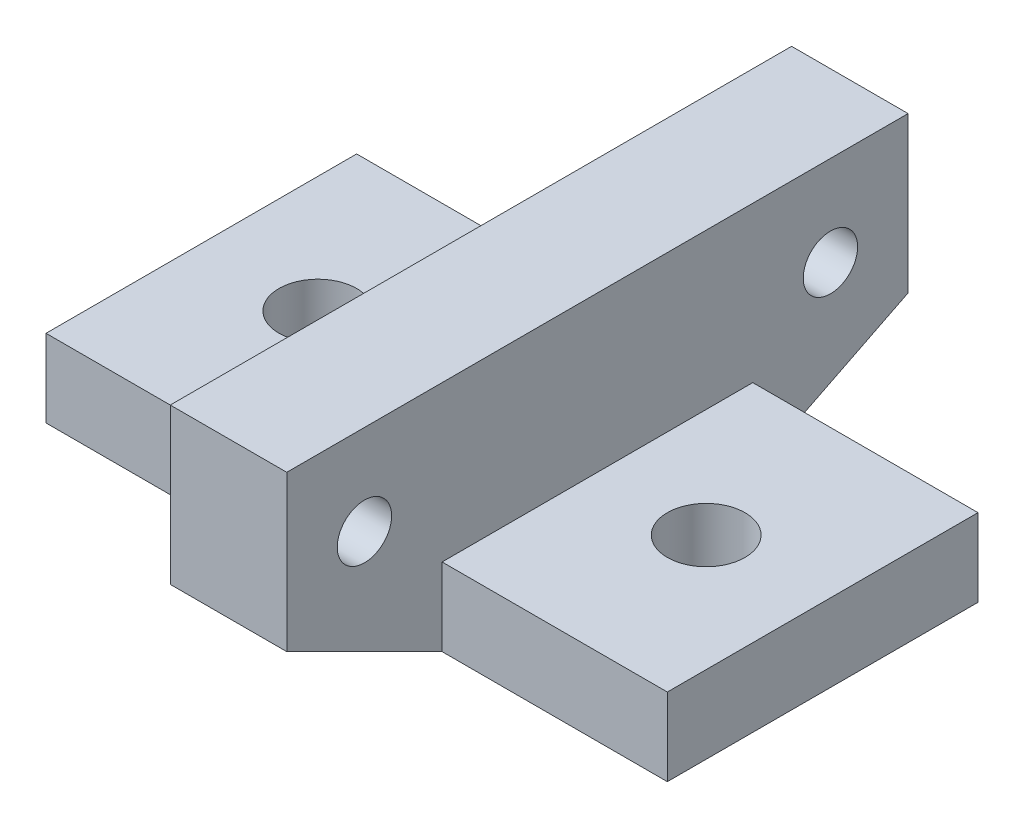
ISO-10303-21;
HEADER;
FILE_DESCRIPTION(('STEP AP214'),'2;1');
FILE_NAME('part.step','',(''),(''),'','','');
FILE_SCHEMA(('AUTOMOTIVE_DESIGN { 1 0 10303 214 1 1 1 1 }'));
ENDSEC;
DATA;
#1=APPLICATION_CONTEXT('core data for automotive mechanical design processes');
#2=APPLICATION_PROTOCOL_DEFINITION('international standard','automotive_design',2000,#1);
#3=PRODUCT_CONTEXT('',#1,'mechanical');
#4=PRODUCT('Part','Part','',(#3));
#5=PRODUCT_RELATED_PRODUCT_CATEGORY('part','',(#4));
#6=PRODUCT_DEFINITION_FORMATION('','',#4);
#7=PRODUCT_DEFINITION_CONTEXT('part definition',#1,'design');
#8=PRODUCT_DEFINITION('design','',#6,#7);
#9=PRODUCT_DEFINITION_SHAPE('','',#8);
#10=(LENGTH_UNIT() NAMED_UNIT(*) SI_UNIT(.MILLI.,.METRE.));
#11=(NAMED_UNIT(*) PLANE_ANGLE_UNIT() SI_UNIT($,.RADIAN.));
#12=(NAMED_UNIT(*) SI_UNIT($,.STERADIAN.) SOLID_ANGLE_UNIT());
#13=UNCERTAINTY_MEASURE_WITH_UNIT(LENGTH_MEASURE(1.E-05),#10,'distance_accuracy_value','');
#14=(GEOMETRIC_REPRESENTATION_CONTEXT(3) GLOBAL_UNCERTAINTY_ASSIGNED_CONTEXT((#13)) GLOBAL_UNIT_ASSIGNED_CONTEXT((#10,
#11,#12)) REPRESENTATION_CONTEXT('',''));
#15=CARTESIAN_POINT('',(0.,0.,0.));
#16=DIRECTION('',(0.,0.,1.));
#17=DIRECTION('',(1.,0.,0.));
#18=AXIS2_PLACEMENT_3D('',#15,#16,#17);
#19=CARTESIAN_POINT('',(-20.,5.,-10.));
#20=DIRECTION('',(0.,0.,1.));
#21=DIRECTION('',(1.,0.,0.));
#22=AXIS2_PLACEMENT_3D('',#19,#20,#21);
#23=PLANE('',#22);
#24=DIRECTION('',(0.,1.,0.));
#25=VECTOR('',#24,1.);
#26=CARTESIAN_POINT('',(-2.,5.,-10.));
#27=LINE('',#26,#25);
#28=CARTESIAN_POINT('',(-2.,0.,-9.99999999999999));
#29=VERTEX_POINT('',#28);
#30=CARTESIAN_POINT('',(-2.,5.,-10.));
#31=VERTEX_POINT('',#30);
#32=EDGE_CURVE('E57',#29,#31,#27,.T.);
#33=ORIENTED_EDGE('',*,*,#32,.F.);
#34=DIRECTION('',(-1.,0.,0.));
#35=VECTOR('',#34,1.);
#36=CARTESIAN_POINT('',(-20.,0.,-10.));
#37=LINE('',#36,#35);
#38=CARTESIAN_POINT('',(-20.,0.,-10.));
#39=VERTEX_POINT('',#38);
#40=EDGE_CURVE('E255',#29,#39,#37,.T.);
#41=ORIENTED_EDGE('',*,*,#40,.T.);
#42=DIRECTION('',(0.,-1.,0.));
#43=VECTOR('',#42,1.);
#44=CARTESIAN_POINT('',(-20.,5.,-10.));
#45=LINE('',#44,#43);
#46=CARTESIAN_POINT('',(-20.,5.,-10.));
#47=VERTEX_POINT('',#46);
#48=EDGE_CURVE('E270',#47,#39,#45,.T.);
#49=ORIENTED_EDGE('',*,*,#48,.F.);
#50=DIRECTION('',(-1.,0.,0.));
#51=VECTOR('',#50,1.);
#52=CARTESIAN_POINT('',(-20.,5.,-10.));
#53=LINE('',#52,#51);
#54=EDGE_CURVE('E157',#31,#47,#53,.T.);
#55=ORIENTED_EDGE('',*,*,#54,.F.);
#56=EDGE_LOOP('',(#33,#41,#49,#55));
#57=FACE_BOUND('',#56,.T.);
#58=ADVANCED_FACE('F39',(#57),#23,.F.);
#59=CARTESIAN_POINT('',(-20.,5.,10.));
#60=DIRECTION('',(0.,0.,-1.));
#61=DIRECTION('',(-1.,0.,0.));
#62=AXIS2_PLACEMENT_3D('',#59,#60,#61);
#63=PLANE('',#62);
#64=DIRECTION('',(0.,1.,0.));
#65=VECTOR('',#64,1.);
#66=CARTESIAN_POINT('',(5.5,0.,10.));
#67=LINE('',#66,#65);
#68=CARTESIAN_POINT('',(5.5,0.,10.));
#69=VERTEX_POINT('',#68);
#70=CARTESIAN_POINT('',(5.5,5.,10.));
#71=VERTEX_POINT('',#70);
#72=EDGE_CURVE('E162',#69,#71,#67,.T.);
#73=ORIENTED_EDGE('',*,*,#72,.F.);
#74=DIRECTION('',(1.,0.,0.));
#75=VECTOR('',#74,1.);
#76=CARTESIAN_POINT('',(-20.,0.,10.));
#77=LINE('',#76,#75);
#78=CARTESIAN_POINT('',(20.,0.,10.));
#79=VERTEX_POINT('',#78);
#80=EDGE_CURVE('E88',#69,#79,#77,.T.);
#81=ORIENTED_EDGE('',*,*,#80,.T.);
#82=DIRECTION('',(0.,-1.,0.));
#83=VECTOR('',#82,1.);
#84=CARTESIAN_POINT('',(20.,5.,10.));
#85=LINE('',#84,#83);
#86=CARTESIAN_POINT('',(20.,5.,10.));
#87=VERTEX_POINT('',#86);
#88=EDGE_CURVE('E251',#87,#79,#85,.T.);
#89=ORIENTED_EDGE('',*,*,#88,.F.);
#90=DIRECTION('',(1.,0.,0.));
#91=VECTOR('',#90,1.);
#92=CARTESIAN_POINT('',(-20.,5.,10.));
#93=LINE('',#92,#91);
#94=EDGE_CURVE('E66',#71,#87,#93,.T.);
#95=ORIENTED_EDGE('',*,*,#94,.F.);
#96=EDGE_LOOP('',(#73,#81,#89,#95));
#97=FACE_BOUND('',#96,.T.);
#98=ADVANCED_FACE('F302',(#97),#63,.F.);
#99=DIRECTION('',(0.,-1.,0.));
#100=VECTOR('',#99,1.);
#101=CARTESIAN_POINT('',(-2.,0.,10.));
#102=LINE('',#101,#100);
#103=CARTESIAN_POINT('',(-2.,5.,10.));
#104=VERTEX_POINT('',#103);
#105=CARTESIAN_POINT('',(-1.99999999999999,0.,10.));
#106=VERTEX_POINT('',#105);
#107=EDGE_CURVE('E169',#104,#106,#102,.T.);
#108=ORIENTED_EDGE('',*,*,#107,.F.);
#109=CARTESIAN_POINT('',(-20.,5.,10.));
#110=VERTEX_POINT('',#109);
#111=EDGE_CURVE('E247',#110,#104,#93,.T.);
#112=ORIENTED_EDGE('',*,*,#111,.F.);
#113=DIRECTION('',(0.,-1.,0.));
#114=VECTOR('',#113,1.);
#115=CARTESIAN_POINT('',(-20.,5.,10.));
#116=LINE('',#115,#114);
#117=CARTESIAN_POINT('',(-20.,0.,10.));
#118=VERTEX_POINT('',#117);
#119=EDGE_CURVE('E266',#110,#118,#116,.T.);
#120=ORIENTED_EDGE('',*,*,#119,.T.);
#121=EDGE_CURVE('E243',#118,#106,#77,.T.);
#122=ORIENTED_EDGE('',*,*,#121,.T.);
#123=EDGE_LOOP('',(#108,#112,#120,#122));
#124=FACE_BOUND('',#123,.T.);
#125=ADVANCED_FACE('F307',(#124),#63,.F.);
#126=CARTESIAN_POINT('',(0.,5.,0.));
#127=DIRECTION('',(0.,1.,0.));
#128=DIRECTION('',(0.,0.,1.));
#129=AXIS2_PLACEMENT_3D('',#126,#127,#128);
#130=PLANE('',#129);
#131=DIRECTION('',(0.,0.,-1.));
#132=VECTOR('',#131,1.);
#133=CARTESIAN_POINT('',(5.49999999999999,5.,-20.));
#134=LINE('',#133,#132);
#135=CARTESIAN_POINT('',(5.5,5.,-10.));
#136=VERTEX_POINT('',#135);
#137=EDGE_CURVE('E11',#71,#136,#134,.T.);
#138=ORIENTED_EDGE('',*,*,#137,.F.);
#139=ORIENTED_EDGE('',*,*,#94,.T.);
#140=DIRECTION('',(0.,0.,-1.));
#141=VECTOR('',#140,1.);
#142=CARTESIAN_POINT('',(20.,5.,-10.));
#143=LINE('',#142,#141);
#144=CARTESIAN_POINT('',(20.,5.,-10.));
#145=VERTEX_POINT('',#144);
#146=EDGE_CURVE('E153',#87,#145,#143,.T.);
#147=ORIENTED_EDGE('',*,*,#146,.T.);
#148=EDGE_CURVE('E96',#145,#136,#53,.T.);
#149=ORIENTED_EDGE('',*,*,#148,.T.);
#150=EDGE_LOOP('',(#138,#139,#147,#149));
#151=FACE_BOUND('',#150,.T.);
#152=CARTESIAN_POINT('',(12.5,5.,0.));
#153=DIRECTION('',(0.,1.,0.));
#154=DIRECTION('',(0.,0.,1.));
#155=AXIS2_PLACEMENT_3D('',#152,#153,#154);
#156=CIRCLE('',#155,2.5);
#157=CARTESIAN_POINT('',(12.5,5.,2.5));
#158=VERTEX_POINT('',#157);
#159=EDGE_CURVE('E226',#158,#158,#156,.T.);
#160=ORIENTED_EDGE('',*,*,#159,.F.);
#161=EDGE_LOOP('',(#160));
#162=FACE_BOUND('',#161,.T.);
#163=ADVANCED_FACE('F150',(#151,#162),#130,.T.);
#164=DIRECTION('',(0.,0.,1.));
#165=VECTOR('',#164,1.);
#166=CARTESIAN_POINT('',(-2.00000000000001,5.,-20.));
#167=LINE('',#166,#165);
#168=EDGE_CURVE('E49',#31,#104,#167,.T.);
#169=ORIENTED_EDGE('',*,*,#168,.F.);
#170=ORIENTED_EDGE('',*,*,#54,.T.);
#171=DIRECTION('',(0.,0.,1.));
#172=VECTOR('',#171,1.);
#173=CARTESIAN_POINT('',(-20.,5.,-10.));
#174=LINE('',#173,#172);
#175=EDGE_CURVE('E156',#47,#110,#174,.T.);
#176=ORIENTED_EDGE('',*,*,#175,.T.);
#177=ORIENTED_EDGE('',*,*,#111,.T.);
#178=EDGE_LOOP('',(#169,#170,#176,#177));
#179=FACE_BOUND('',#178,.T.);
#180=CARTESIAN_POINT('',(-12.5,5.,0.));
#181=DIRECTION('',(0.,1.,0.));
#182=DIRECTION('',(0.,0.,1.));
#183=AXIS2_PLACEMENT_3D('',#180,#181,#182);
#184=CIRCLE('',#183,2.5);
#185=CARTESIAN_POINT('',(-12.5,5.,2.5));
#186=VERTEX_POINT('',#185);
#187=EDGE_CURVE('E234',#186,#186,#184,.T.);
#188=ORIENTED_EDGE('',*,*,#187,.F.);
#189=EDGE_LOOP('',(#188));
#190=FACE_BOUND('',#189,.T.);
#191=ADVANCED_FACE('F323',(#179,#190),#130,.T.);
#192=CARTESIAN_POINT('',(0.,0.,0.));
#193=DIRECTION('',(0.,1.,0.));
#194=DIRECTION('',(0.,0.,1.));
#195=AXIS2_PLACEMENT_3D('',#192,#193,#194);
#196=PLANE('',#195);
#197=DIRECTION('',(0.,0.,-1.));
#198=VECTOR('',#197,1.);
#199=CARTESIAN_POINT('',(20.,0.,-10.));
#200=LINE('',#199,#198);
#201=CARTESIAN_POINT('',(20.,0.,-10.));
#202=VERTEX_POINT('',#201);
#203=EDGE_CURVE('E238',#79,#202,#200,.T.);
#204=ORIENTED_EDGE('',*,*,#203,.F.);
#205=ORIENTED_EDGE('',*,*,#80,.F.);
#206=DIRECTION('',(1.,0.,0.));
#207=VECTOR('',#206,1.);
#208=CARTESIAN_POINT('',(-13.180339887499,0.,10.));
#209=LINE('',#208,#207);
#210=EDGE_CURVE('E165',#106,#69,#209,.T.);
#211=ORIENTED_EDGE('',*,*,#210,.F.);
#212=ORIENTED_EDGE('',*,*,#121,.F.);
#213=DIRECTION('',(0.,0.,1.));
#214=VECTOR('',#213,1.);
#215=CARTESIAN_POINT('',(-20.,0.,-10.));
#216=LINE('',#215,#214);
#217=EDGE_CURVE('E258',#39,#118,#216,.T.);
#218=ORIENTED_EDGE('',*,*,#217,.F.);
#219=ORIENTED_EDGE('',*,*,#40,.F.);
#220=DIRECTION('',(1.,0.,0.));
#221=VECTOR('',#220,1.);
#222=CARTESIAN_POINT('',(-13.180339887499,0.,-9.99999999999999));
#223=LINE('',#222,#221);
#224=CARTESIAN_POINT('',(5.5,0.,-9.99999999999999));
#225=VERTEX_POINT('',#224);
#226=EDGE_CURVE('E332',#29,#225,#223,.T.);
#227=ORIENTED_EDGE('',*,*,#226,.T.);
#228=EDGE_CURVE('E143',#202,#225,#37,.T.);
#229=ORIENTED_EDGE('',*,*,#228,.F.);
#230=EDGE_LOOP('',(#204,#205,#211,#212,#218,#219,#227,#229));
#231=FACE_BOUND('',#230,.T.);
#232=CARTESIAN_POINT('',(-12.5,0.,0.));
#233=DIRECTION('',(0.,1.,0.));
#234=DIRECTION('',(0.,0.,1.));
#235=AXIS2_PLACEMENT_3D('',#232,#233,#234);
#236=CIRCLE('',#235,2.5);
#237=CARTESIAN_POINT('',(-12.5,0.,2.5));
#238=VERTEX_POINT('',#237);
#239=EDGE_CURVE('E230',#238,#238,#236,.T.);
#240=ORIENTED_EDGE('',*,*,#239,.T.);
#241=EDGE_LOOP('',(#240));
#242=FACE_BOUND('',#241,.T.);
#243=CARTESIAN_POINT('',(12.5,0.,0.));
#244=DIRECTION('',(0.,1.,0.));
#245=DIRECTION('',(0.,0.,1.));
#246=AXIS2_PLACEMENT_3D('',#243,#244,#245);
#247=CIRCLE('',#246,2.5);
#248=CARTESIAN_POINT('',(12.5,0.,2.5));
#249=VERTEX_POINT('',#248);
#250=EDGE_CURVE('E225',#249,#249,#247,.T.);
#251=ORIENTED_EDGE('',*,*,#250,.T.);
#252=EDGE_LOOP('',(#251));
#253=FACE_BOUND('',#252,.T.);
#254=ADVANCED_FACE('F318',(#231,#242,#253),#196,.F.);
#255=CARTESIAN_POINT('',(20.,5.,-10.));
#256=DIRECTION('',(-1.,0.,0.));
#257=DIRECTION('',(0.,0.,1.));
#258=AXIS2_PLACEMENT_3D('',#255,#256,#257);
#259=PLANE('',#258);
#260=ORIENTED_EDGE('',*,*,#203,.T.);
#261=DIRECTION('',(0.,-1.,0.));
#262=VECTOR('',#261,1.);
#263=CARTESIAN_POINT('',(20.,5.,-10.));
#264=LINE('',#263,#262);
#265=EDGE_CURVE('E207',#145,#202,#264,.T.);
#266=ORIENTED_EDGE('',*,*,#265,.F.);
#267=ORIENTED_EDGE('',*,*,#146,.F.);
#268=ORIENTED_EDGE('',*,*,#88,.T.);
#269=EDGE_LOOP('',(#260,#266,#267,#268));
#270=FACE_BOUND('',#269,.T.);
#271=ADVANCED_FACE('F41',(#270),#259,.F.);
#272=ORIENTED_EDGE('',*,*,#228,.T.);
#273=DIRECTION('',(0.,-1.,0.));
#274=VECTOR('',#273,1.);
#275=CARTESIAN_POINT('',(5.5,5.,-10.));
#276=LINE('',#275,#274);
#277=EDGE_CURVE('E141',#136,#225,#276,.T.);
#278=ORIENTED_EDGE('',*,*,#277,.F.);
#279=ORIENTED_EDGE('',*,*,#148,.F.);
#280=ORIENTED_EDGE('',*,*,#265,.T.);
#281=EDGE_LOOP('',(#272,#278,#279,#280));
#282=FACE_BOUND('',#281,.T.);
#283=ADVANCED_FACE('F142',(#282),#23,.F.);
#284=CARTESIAN_POINT('',(-20.,5.,-10.));
#285=DIRECTION('',(1.,0.,0.));
#286=DIRECTION('',(0.,0.,-1.));
#287=AXIS2_PLACEMENT_3D('',#284,#285,#286);
#288=PLANE('',#287);
#289=ORIENTED_EDGE('',*,*,#217,.T.);
#290=ORIENTED_EDGE('',*,*,#119,.F.);
#291=ORIENTED_EDGE('',*,*,#175,.F.);
#292=ORIENTED_EDGE('',*,*,#48,.T.);
#293=EDGE_LOOP('',(#289,#290,#291,#292));
#294=FACE_BOUND('',#293,.T.);
#295=ADVANCED_FACE('F311',(#294),#288,.F.);
#296=CARTESIAN_POINT('',(-12.5,5.,0.));
#297=DIRECTION('',(0.,-1.,0.));
#298=DIRECTION('',(0.,0.,-1.));
#299=AXIS2_PLACEMENT_3D('',#296,#297,#298);
#300=CYLINDRICAL_SURFACE('',#299,2.5);
#301=ORIENTED_EDGE('',*,*,#187,.T.);
#302=EDGE_LOOP('',(#301));
#303=FACE_BOUND('',#302,.T.);
#304=ORIENTED_EDGE('',*,*,#239,.F.);
#305=EDGE_LOOP('',(#304));
#306=FACE_BOUND('',#305,.T.);
#307=ADVANCED_FACE('F316',(#303,#306),#300,.F.);
#308=CARTESIAN_POINT('',(12.5,5.,0.));
#309=DIRECTION('',(0.,-1.,0.));
#310=DIRECTION('',(0.,0.,-1.));
#311=AXIS2_PLACEMENT_3D('',#308,#309,#310);
#312=CYLINDRICAL_SURFACE('',#311,2.5);
#313=ORIENTED_EDGE('',*,*,#159,.T.);
#314=EDGE_LOOP('',(#313));
#315=FACE_BOUND('',#314,.T.);
#316=ORIENTED_EDGE('',*,*,#250,.F.);
#317=EDGE_LOOP('',(#316));
#318=FACE_BOUND('',#317,.T.);
#319=ADVANCED_FACE('F367',(#315,#318),#312,.F.);
#320=CARTESIAN_POINT('',(5.49999999999999,15.,-20.));
#321=DIRECTION('',(-1.,0.,0.));
#322=DIRECTION('',(0.,0.,1.));
#323=AXIS2_PLACEMENT_3D('',#320,#321,#322);
#324=PLANE('',#323);
#325=CARTESIAN_POINT('',(5.5,9.2,15.));
#326=DIRECTION('',(1.,0.,0.));
#327=DIRECTION('',(0.,0.,-1.));
#328=AXIS2_PLACEMENT_3D('',#325,#326,#327);
#329=CIRCLE('',#328,1.75);
#330=CARTESIAN_POINT('',(5.5,9.2,13.25));
#331=VERTEX_POINT('',#330);
#332=EDGE_CURVE('E178',#331,#331,#329,.T.);
#333=ORIENTED_EDGE('',*,*,#332,.F.);
#334=EDGE_LOOP('',(#333));
#335=FACE_BOUND('',#334,.T.);
#336=CARTESIAN_POINT('',(5.5,9.2,-15.));
#337=DIRECTION('',(1.,0.,0.));
#338=DIRECTION('',(0.,0.,-1.));
#339=AXIS2_PLACEMENT_3D('',#336,#337,#338);
#340=CIRCLE('',#339,1.75);
#341=CARTESIAN_POINT('',(5.49999999999999,9.2,-16.75));
#342=VERTEX_POINT('',#341);
#343=EDGE_CURVE('E177',#342,#342,#340,.T.);
#344=ORIENTED_EDGE('',*,*,#343,.F.);
#345=EDGE_LOOP('',(#344));
#346=FACE_BOUND('',#345,.T.);
#347=DIRECTION('',(0.,-1.,0.));
#348=VECTOR('',#347,1.);
#349=CARTESIAN_POINT('',(5.50000000000001,15.,20.));
#350=LINE('',#349,#348);
#351=CARTESIAN_POINT('',(5.50000000000001,15.,20.));
#352=VERTEX_POINT('',#351);
#353=CARTESIAN_POINT('',(5.50000000000001,5.,20.));
#354=VERTEX_POINT('',#353);
#355=EDGE_CURVE('E199',#352,#354,#350,.T.);
#356=ORIENTED_EDGE('',*,*,#355,.T.);
#357=DIRECTION('',(0.,-0.447213595499958,-0.894427190999916));
#358=VECTOR('',#357,1.);
#359=CARTESIAN_POINT('',(5.50000000000001,5.,20.));
#360=LINE('',#359,#358);
#361=EDGE_CURVE('E163',#354,#69,#360,.T.);
#362=ORIENTED_EDGE('',*,*,#361,.T.);
#363=ORIENTED_EDGE('',*,*,#72,.T.);
#364=ORIENTED_EDGE('',*,*,#137,.T.);
#365=ORIENTED_EDGE('',*,*,#277,.T.);
#366=DIRECTION('',(0.,0.447213595499958,-0.894427190999916));
#367=VECTOR('',#366,1.);
#368=CARTESIAN_POINT('',(5.5,0.,-9.99999999999999));
#369=LINE('',#368,#367);
#370=CARTESIAN_POINT('',(5.49999999999999,5.,-20.));
#371=VERTEX_POINT('',#370);
#372=EDGE_CURVE('E148',#225,#371,#369,.T.);
#373=ORIENTED_EDGE('',*,*,#372,.T.);
#374=DIRECTION('',(0.,-1.,0.));
#375=VECTOR('',#374,1.);
#376=CARTESIAN_POINT('',(5.49999999999999,15.,-20.));
#377=LINE('',#376,#375);
#378=CARTESIAN_POINT('',(5.49999999999999,15.,-20.));
#379=VERTEX_POINT('',#378);
#380=EDGE_CURVE('E221',#379,#371,#377,.T.);
#381=ORIENTED_EDGE('',*,*,#380,.F.);
#382=DIRECTION('',(0.,0.,-1.));
#383=VECTOR('',#382,1.);
#384=CARTESIAN_POINT('',(5.49999999999999,15.,-20.));
#385=LINE('',#384,#383);
#386=EDGE_CURVE('E186',#352,#379,#385,.T.);
#387=ORIENTED_EDGE('',*,*,#386,.F.);
#388=EDGE_LOOP('',(#356,#362,#363,#364,#365,#373,#381,#387));
#389=FACE_BOUND('',#388,.T.);
#390=ADVANCED_FACE('F160',(#335,#346,#389),#324,.F.);
#391=CARTESIAN_POINT('',(-2.00000000000001,15.,-20.));
#392=DIRECTION('',(0.,0.,1.));
#393=DIRECTION('',(1.,0.,0.));
#394=AXIS2_PLACEMENT_3D('',#391,#392,#393);
#395=PLANE('',#394);
#396=DIRECTION('',(-1.,0.,0.));
#397=VECTOR('',#396,1.);
#398=CARTESIAN_POINT('',(-2.00000000000001,5.,-20.));
#399=LINE('',#398,#397);
#400=CARTESIAN_POINT('',(-2.,5.,-20.));
#401=VERTEX_POINT('',#400);
#402=EDGE_CURVE('E201',#371,#401,#399,.T.);
#403=ORIENTED_EDGE('',*,*,#402,.T.);
#404=DIRECTION('',(0.,-1.,0.));
#405=VECTOR('',#404,1.);
#406=CARTESIAN_POINT('',(-2.00000000000001,15.,-20.));
#407=LINE('',#406,#405);
#408=CARTESIAN_POINT('',(-2.00000000000001,15.,-20.));
#409=VERTEX_POINT('',#408);
#410=EDGE_CURVE('E217',#409,#401,#407,.T.);
#411=ORIENTED_EDGE('',*,*,#410,.F.);
#412=DIRECTION('',(-1.,0.,0.));
#413=VECTOR('',#412,1.);
#414=CARTESIAN_POINT('',(-2.00000000000001,15.,-20.));
#415=LINE('',#414,#413);
#416=EDGE_CURVE('E190',#379,#409,#415,.T.);
#417=ORIENTED_EDGE('',*,*,#416,.F.);
#418=ORIENTED_EDGE('',*,*,#380,.T.);
#419=EDGE_LOOP('',(#403,#411,#417,#418));
#420=FACE_BOUND('',#419,.T.);
#421=ADVANCED_FACE('F379',(#420),#395,.F.);
#422=CARTESIAN_POINT('',(-2.00000000000001,15.,-20.));
#423=DIRECTION('',(1.,0.,0.));
#424=DIRECTION('',(0.,0.,-1.));
#425=AXIS2_PLACEMENT_3D('',#422,#423,#424);
#426=PLANE('',#425);
#427=CARTESIAN_POINT('',(-2.,9.2,15.));
#428=DIRECTION('',(1.,0.,0.));
#429=DIRECTION('',(0.,0.,-1.));
#430=AXIS2_PLACEMENT_3D('',#427,#428,#429);
#431=CIRCLE('',#430,1.75);
#432=CARTESIAN_POINT('',(-2.,9.2,13.25));
#433=VERTEX_POINT('',#432);
#434=EDGE_CURVE('E43',#433,#433,#431,.T.);
#435=ORIENTED_EDGE('',*,*,#434,.T.);
#436=EDGE_LOOP('',(#435));
#437=FACE_BOUND('',#436,.T.);
#438=CARTESIAN_POINT('',(-2.,9.2,-15.));
#439=DIRECTION('',(1.,0.,0.));
#440=DIRECTION('',(0.,0.,-1.));
#441=AXIS2_PLACEMENT_3D('',#438,#439,#440);
#442=CIRCLE('',#441,1.75);
#443=CARTESIAN_POINT('',(-2.,9.2,-16.75));
#444=VERTEX_POINT('',#443);
#445=EDGE_CURVE('E182',#444,#444,#442,.T.);
#446=ORIENTED_EDGE('',*,*,#445,.T.);
#447=EDGE_LOOP('',(#446));
#448=FACE_BOUND('',#447,.T.);
#449=ORIENTED_EDGE('',*,*,#410,.T.);
#450=DIRECTION('',(0.,-0.447213595499958,0.894427190999916));
#451=VECTOR('',#450,1.);
#452=CARTESIAN_POINT('',(-2.,0.,-9.99999999999999));
#453=LINE('',#452,#451);
#454=EDGE_CURVE('E336',#401,#29,#453,.T.);
#455=ORIENTED_EDGE('',*,*,#454,.T.);
#456=ORIENTED_EDGE('',*,*,#32,.T.);
#457=ORIENTED_EDGE('',*,*,#168,.T.);
#458=ORIENTED_EDGE('',*,*,#107,.T.);
#459=DIRECTION('',(0.,0.447213595499958,0.894427190999916));
#460=VECTOR('',#459,1.);
#461=CARTESIAN_POINT('',(-1.99999999999999,5.,20.));
#462=LINE('',#461,#460);
#463=CARTESIAN_POINT('',(-1.99999999999999,5.,20.));
#464=VERTEX_POINT('',#463);
#465=EDGE_CURVE('E174',#106,#464,#462,.T.);
#466=ORIENTED_EDGE('',*,*,#465,.T.);
#467=DIRECTION('',(0.,-1.,0.));
#468=VECTOR('',#467,1.);
#469=CARTESIAN_POINT('',(-1.99999999999999,15.,20.));
#470=LINE('',#469,#468);
#471=CARTESIAN_POINT('',(-1.99999999999999,15.,20.));
#472=VERTEX_POINT('',#471);
#473=EDGE_CURVE('E213',#472,#464,#470,.T.);
#474=ORIENTED_EDGE('',*,*,#473,.F.);
#475=DIRECTION('',(0.,0.,1.));
#476=VECTOR('',#475,1.);
#477=CARTESIAN_POINT('',(-2.00000000000001,15.,-20.));
#478=LINE('',#477,#476);
#479=EDGE_CURVE('E194',#409,#472,#478,.T.);
#480=ORIENTED_EDGE('',*,*,#479,.F.);
#481=EDGE_LOOP('',(#449,#455,#456,#457,#458,#466,#474,#480));
#482=FACE_BOUND('',#481,.T.);
#483=ADVANCED_FACE('F283',(#437,#448,#482),#426,.F.);
#484=CARTESIAN_POINT('',(-1.99999999999999,15.,20.));
#485=DIRECTION('',(0.,0.,-1.));
#486=DIRECTION('',(-1.,0.,0.));
#487=AXIS2_PLACEMENT_3D('',#484,#485,#486);
#488=PLANE('',#487);
#489=DIRECTION('',(1.,0.,0.));
#490=VECTOR('',#489,1.);
#491=CARTESIAN_POINT('',(-1.99999999999999,5.,20.));
#492=LINE('',#491,#490);
#493=EDGE_CURVE('E191',#464,#354,#492,.T.);
#494=ORIENTED_EDGE('',*,*,#493,.T.);
#495=ORIENTED_EDGE('',*,*,#355,.F.);
#496=DIRECTION('',(1.,0.,0.));
#497=VECTOR('',#496,1.);
#498=CARTESIAN_POINT('',(-1.99999999999999,15.,20.));
#499=LINE('',#498,#497);
#500=EDGE_CURVE('E197',#472,#352,#499,.T.);
#501=ORIENTED_EDGE('',*,*,#500,.F.);
#502=ORIENTED_EDGE('',*,*,#473,.T.);
#503=EDGE_LOOP('',(#494,#495,#501,#502));
#504=FACE_BOUND('',#503,.T.);
#505=ADVANCED_FACE('F388',(#504),#488,.F.);
#506=CARTESIAN_POINT('',(0.,15.,0.));
#507=DIRECTION('',(0.,1.,0.));
#508=DIRECTION('',(0.,0.,1.));
#509=AXIS2_PLACEMENT_3D('',#506,#507,#508);
#510=PLANE('',#509);
#511=ORIENTED_EDGE('',*,*,#386,.T.);
#512=ORIENTED_EDGE('',*,*,#416,.T.);
#513=ORIENTED_EDGE('',*,*,#479,.T.);
#514=ORIENTED_EDGE('',*,*,#500,.T.);
#515=EDGE_LOOP('',(#511,#512,#513,#514));
#516=FACE_BOUND('',#515,.T.);
#517=ADVANCED_FACE('F298',(#516),#510,.T.);
#518=CARTESIAN_POINT('',(-4.5,9.2,-15.));
#519=DIRECTION('',(1.,0.,0.));
#520=DIRECTION('',(0.,0.,-1.));
#521=AXIS2_PLACEMENT_3D('',#518,#519,#520);
#522=CYLINDRICAL_SURFACE('',#521,1.75);
#523=ORIENTED_EDGE('',*,*,#343,.T.);
#524=EDGE_LOOP('',(#523));
#525=FACE_BOUND('',#524,.T.);
#526=ORIENTED_EDGE('',*,*,#445,.F.);
#527=EDGE_LOOP('',(#526));
#528=FACE_BOUND('',#527,.T.);
#529=ADVANCED_FACE('F288',(#525,#528),#522,.F.);
#530=CARTESIAN_POINT('',(-4.5,9.2,15.));
#531=DIRECTION('',(1.,0.,0.));
#532=DIRECTION('',(0.,0.,-1.));
#533=AXIS2_PLACEMENT_3D('',#530,#531,#532);
#534=CYLINDRICAL_SURFACE('',#533,1.75);
#535=ORIENTED_EDGE('',*,*,#332,.T.);
#536=EDGE_LOOP('',(#535));
#537=FACE_BOUND('',#536,.T.);
#538=ORIENTED_EDGE('',*,*,#434,.F.);
#539=EDGE_LOOP('',(#538));
#540=FACE_BOUND('',#539,.T.);
#541=ADVANCED_FACE('F285',(#537,#540),#534,.F.);
#542=CARTESIAN_POINT('',(-13.180339887499,5.,20.));
#543=DIRECTION('',(0.,-0.894427190999916,0.447213595499958));
#544=DIRECTION('',(0.,-0.447213595499958,-0.894427190999916));
#545=AXIS2_PLACEMENT_3D('',#542,#543,#544);
#546=PLANE('',#545);
#547=ORIENTED_EDGE('',*,*,#465,.F.);
#548=ORIENTED_EDGE('',*,*,#210,.T.);
#549=ORIENTED_EDGE('',*,*,#361,.F.);
#550=ORIENTED_EDGE('',*,*,#493,.F.);
#551=EDGE_LOOP('',(#547,#548,#549,#550));
#552=FACE_BOUND('',#551,.T.);
#553=ADVANCED_FACE('F287',(#552),#546,.T.);
#554=CARTESIAN_POINT('',(-13.180339887499,0.,-9.99999999999999));
#555=DIRECTION('',(0.,-0.894427190999916,-0.447213595499958));
#556=DIRECTION('',(0.,0.447213595499958,-0.894427190999916));
#557=AXIS2_PLACEMENT_3D('',#554,#555,#556);
#558=PLANE('',#557);
#559=ORIENTED_EDGE('',*,*,#454,.F.);
#560=ORIENTED_EDGE('',*,*,#402,.F.);
#561=ORIENTED_EDGE('',*,*,#372,.F.);
#562=ORIENTED_EDGE('',*,*,#226,.F.);
#563=EDGE_LOOP('',(#559,#560,#561,#562));
#564=FACE_BOUND('',#563,.T.);
#565=ADVANCED_FACE('F295',(#564),#558,.T.);
#566=CLOSED_SHELL('',(#58,#98,#125,#163,#191,#254,#271,#283,#295,#307,#319,#390,#421,#483,#505,
#517,#529,#541,#553,#565));
#567=MANIFOLD_SOLID_BREP('B2',#566);
#568=ADVANCED_BREP_SHAPE_REPRESENTATION('',(#18,#567),#14);
#569=SHAPE_DEFINITION_REPRESENTATION(#9,#568);
ENDSEC;
END-ISO-10303-21;
